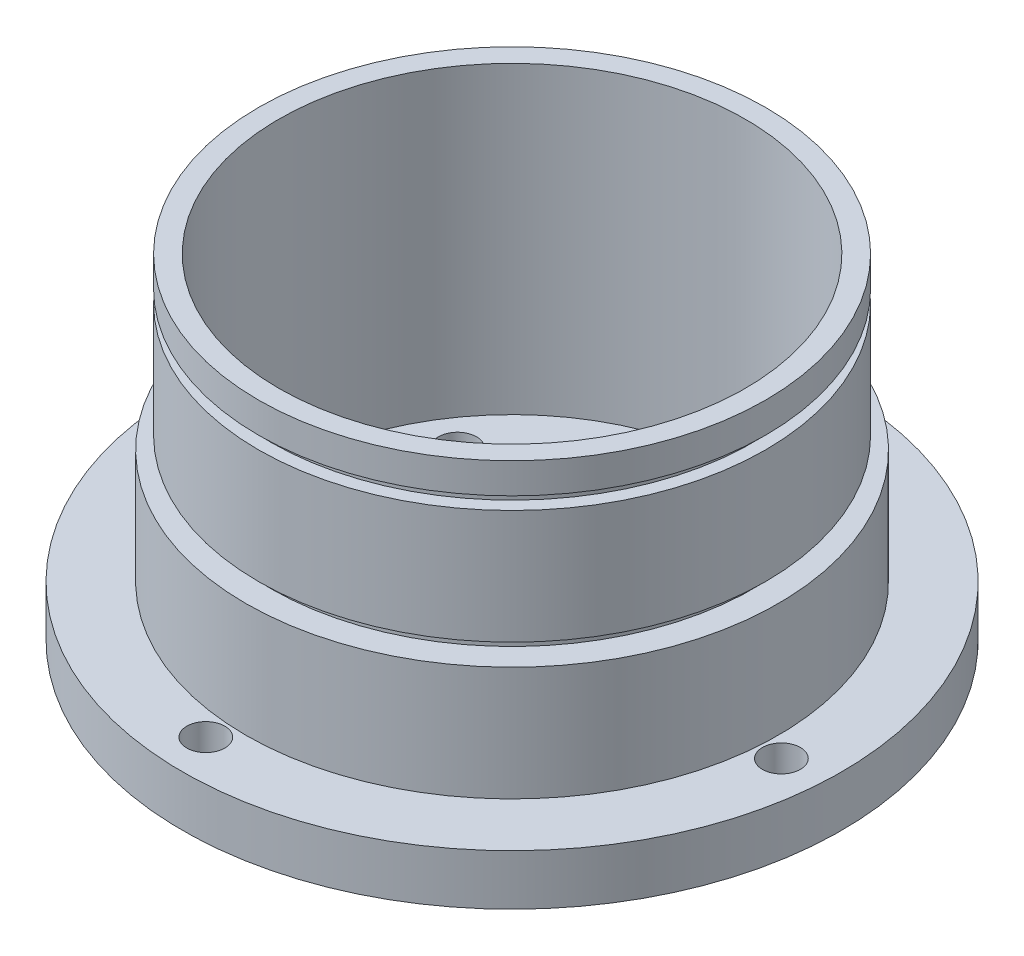
ISO-10303-21;
HEADER;
FILE_DESCRIPTION(('STEP AP214'),'2;1');
FILE_NAME('part.step','',(''),(''),'','','');
FILE_SCHEMA(('AUTOMOTIVE_DESIGN { 1 0 10303 214 1 1 1 1 }'));
ENDSEC;
DATA;
#1=APPLICATION_CONTEXT('core data for automotive mechanical design processes');
#2=APPLICATION_PROTOCOL_DEFINITION('international standard','automotive_design',2000,#1);
#3=PRODUCT_CONTEXT('',#1,'mechanical');
#4=PRODUCT('Part','Part','',(#3));
#5=PRODUCT_RELATED_PRODUCT_CATEGORY('part','',(#4));
#6=PRODUCT_DEFINITION_FORMATION('','',#4);
#7=PRODUCT_DEFINITION_CONTEXT('part definition',#1,'design');
#8=PRODUCT_DEFINITION('design','',#6,#7);
#9=PRODUCT_DEFINITION_SHAPE('','',#8);
#10=(LENGTH_UNIT() NAMED_UNIT(*) SI_UNIT(.MILLI.,.METRE.));
#11=(NAMED_UNIT(*) PLANE_ANGLE_UNIT() SI_UNIT($,.RADIAN.));
#12=(NAMED_UNIT(*) SI_UNIT($,.STERADIAN.) SOLID_ANGLE_UNIT());
#13=UNCERTAINTY_MEASURE_WITH_UNIT(LENGTH_MEASURE(1.E-05),#10,'distance_accuracy_value','');
#14=(GEOMETRIC_REPRESENTATION_CONTEXT(3) GLOBAL_UNCERTAINTY_ASSIGNED_CONTEXT((#13)) GLOBAL_UNIT_ASSIGNED_CONTEXT((#10,
#11,#12)) REPRESENTATION_CONTEXT('',''));
#15=CARTESIAN_POINT('',(0.,0.,0.));
#16=DIRECTION('',(0.,0.,1.));
#17=DIRECTION('',(1.,0.,0.));
#18=AXIS2_PLACEMENT_3D('',#15,#16,#17);
#19=CARTESIAN_POINT('',(0.,34.,0.));
#20=DIRECTION('',(0.,-1.,0.));
#21=DIRECTION('',(0.,0.,-1.));
#22=AXIS2_PLACEMENT_3D('',#19,#20,#21);
#23=CYLINDRICAL_SURFACE('',#22,20.);
#24=CARTESIAN_POINT('',(0.,26.4,0.));
#25=DIRECTION('',(0.,1.,0.));
#26=DIRECTION('',(0.,0.,1.));
#27=AXIS2_PLACEMENT_3D('',#24,#25,#26);
#28=CIRCLE('',#27,20.);
#29=CARTESIAN_POINT('',(0.,26.4,20.));
#30=VERTEX_POINT('',#29);
#31=EDGE_CURVE('E120',#30,#30,#28,.T.);
#32=ORIENTED_EDGE('',*,*,#31,.F.);
#33=EDGE_LOOP('',(#32));
#34=FACE_BOUND('',#33,.T.);
#35=CARTESIAN_POINT('',(0.,24.,0.));
#36=DIRECTION('',(0.,-1.,0.));
#37=DIRECTION('',(0.,0.,-1.));
#38=AXIS2_PLACEMENT_3D('',#35,#36,#37);
#39=CIRCLE('',#38,20.);
#40=CARTESIAN_POINT('',(0.,24.,-20.));
#41=VERTEX_POINT('',#40);
#42=EDGE_CURVE('E112',#41,#41,#39,.T.);
#43=ORIENTED_EDGE('',*,*,#42,.F.);
#44=EDGE_LOOP('',(#43));
#45=FACE_BOUND('',#44,.T.);
#46=ADVANCED_FACE('F37',(#34,#45),#23,.T.);
#47=CARTESIAN_POINT('',(0.,26.4,0.));
#48=DIRECTION('',(0.,1.,0.));
#49=DIRECTION('',(0.,0.,1.));
#50=AXIS2_PLACEMENT_3D('',#47,#48,#49);
#51=PLANE('',#50);
#52=CARTESIAN_POINT('',(0.,26.4,0.));
#53=DIRECTION('',(0.,1.,0.));
#54=DIRECTION('',(0.,0.,1.));
#55=AXIS2_PLACEMENT_3D('',#52,#53,#54);
#56=CIRCLE('',#55,18.4);
#57=CARTESIAN_POINT('',(0.,26.4,18.4));
#58=VERTEX_POINT('',#57);
#59=EDGE_CURVE('E179',#58,#58,#56,.T.);
#60=ORIENTED_EDGE('',*,*,#59,.F.);
#61=EDGE_LOOP('',(#60));
#62=FACE_BOUND('',#61,.T.);
#63=ORIENTED_EDGE('',*,*,#31,.T.);
#64=EDGE_LOOP('',(#63));
#65=FACE_BOUND('',#64,.T.);
#66=ADVANCED_FACE('F231',(#62,#65),#51,.T.);
#67=CARTESIAN_POINT('',(0.,14.,0.));
#68=DIRECTION('',(0.,-1.,0.));
#69=DIRECTION('',(0.,0.,-1.));
#70=AXIS2_PLACEMENT_3D('',#67,#68,#69);
#71=PLANE('',#70);
#72=CARTESIAN_POINT('',(0.,14.,0.));
#73=DIRECTION('',(0.,-1.,0.));
#74=DIRECTION('',(0.,0.,-1.));
#75=AXIS2_PLACEMENT_3D('',#72,#73,#74);
#76=CIRCLE('',#75,19.);
#77=CARTESIAN_POINT('',(0.,14.,-19.));
#78=VERTEX_POINT('',#77);
#79=EDGE_CURVE('E124',#78,#78,#76,.T.);
#80=ORIENTED_EDGE('',*,*,#79,.F.);
#81=EDGE_LOOP('',(#80));
#82=FACE_BOUND('',#81,.T.);
#83=CARTESIAN_POINT('',(0.,14.,0.));
#84=DIRECTION('',(0.,-1.,0.));
#85=DIRECTION('',(0.,0.,-1.));
#86=AXIS2_PLACEMENT_3D('',#83,#84,#85);
#87=CIRCLE('',#86,20.);
#88=CARTESIAN_POINT('',(0.,14.,-20.));
#89=VERTEX_POINT('',#88);
#90=EDGE_CURVE('E115',#89,#89,#87,.T.);
#91=ORIENTED_EDGE('',*,*,#90,.T.);
#92=EDGE_LOOP('',(#91));
#93=FACE_BOUND('',#92,.T.);
#94=ADVANCED_FACE('F238',(#82,#93),#71,.T.);
#95=CARTESIAN_POINT('',(0.,26.4,0.));
#96=DIRECTION('',(0.,-1.,0.));
#97=DIRECTION('',(0.,0.,-1.));
#98=AXIS2_PLACEMENT_3D('',#95,#96,#97);
#99=CYLINDRICAL_SURFACE('',#98,21.);
#100=CARTESIAN_POINT('',(0.,13.,0.));
#101=DIRECTION('',(0.,-1.,0.));
#102=DIRECTION('',(0.,0.,-1.));
#103=AXIS2_PLACEMENT_3D('',#100,#101,#102);
#104=CIRCLE('',#103,21.);
#105=CARTESIAN_POINT('',(0.,13.,-21.));
#106=VERTEX_POINT('',#105);
#107=EDGE_CURVE('E127',#106,#106,#104,.T.);
#108=ORIENTED_EDGE('',*,*,#107,.T.);
#109=EDGE_LOOP('',(#108));
#110=FACE_BOUND('',#109,.T.);
#111=CARTESIAN_POINT('',(0.,4.,0.));
#112=DIRECTION('',(0.,-1.,0.));
#113=DIRECTION('',(0.,0.,-1.));
#114=AXIS2_PLACEMENT_3D('',#111,#112,#113);
#115=CIRCLE('',#114,21.);
#116=CARTESIAN_POINT('',(0.,4.,-21.));
#117=VERTEX_POINT('',#116);
#118=EDGE_CURVE('E178',#117,#117,#115,.T.);
#119=ORIENTED_EDGE('',*,*,#118,.F.);
#120=EDGE_LOOP('',(#119));
#121=FACE_BOUND('',#120,.T.);
#122=ADVANCED_FACE('F39',(#110,#121),#99,.T.);
#123=CARTESIAN_POINT('',(0.,0.,0.));
#124=DIRECTION('',(0.,1.,0.));
#125=DIRECTION('',(0.,0.,1.));
#126=AXIS2_PLACEMENT_3D('',#123,#124,#125);
#127=PLANE('',#126);
#128=DIRECTION('',(-1.,0.,0.));
#129=VECTOR('',#128,1.);
#130=CARTESIAN_POINT('',(7.,0.,6.01880927317566));
#131=LINE('',#130,#129);
#132=CARTESIAN_POINT('',(7.,0.,6.01880927317566));
#133=VERTEX_POINT('',#132);
#134=CARTESIAN_POINT('',(-6.40139772325909,0.,6.01880927317566));
#135=VERTEX_POINT('',#134);
#136=EDGE_CURVE('E89',#133,#135,#131,.T.);
#137=ORIENTED_EDGE('',*,*,#136,.F.);
#138=CARTESIAN_POINT('',(7.,0.,0.));
#139=DIRECTION('',(0.,-1.,0.));
#140=DIRECTION('',(0.,0.,-1.));
#141=AXIS2_PLACEMENT_3D('',#138,#139,#140);
#142=CIRCLE('',#141,6.01880927317566);
#143=CARTESIAN_POINT('',(7.,0.,-6.01880927317566));
#144=VERTEX_POINT('',#143);
#145=EDGE_CURVE('E52',#144,#133,#142,.T.);
#146=ORIENTED_EDGE('',*,*,#145,.F.);
#147=DIRECTION('',(1.,0.,0.));
#148=VECTOR('',#147,1.);
#149=CARTESIAN_POINT('',(7.,0.,-6.01880927317566));
#150=LINE('',#149,#148);
#151=CARTESIAN_POINT('',(-6.40139772325909,0.,-6.01880927317566));
#152=VERTEX_POINT('',#151);
#153=EDGE_CURVE('E96',#152,#144,#150,.T.);
#154=ORIENTED_EDGE('',*,*,#153,.F.);
#155=CARTESIAN_POINT('',(-6.40139772325909,0.,0.));
#156=DIRECTION('',(0.,-1.,0.));
#157=DIRECTION('',(0.,0.,-1.));
#158=AXIS2_PLACEMENT_3D('',#155,#156,#157);
#159=CIRCLE('',#158,6.01880927317566);
#160=EDGE_CURVE('E80',#135,#152,#159,.T.);
#161=ORIENTED_EDGE('',*,*,#160,.F.);
#162=EDGE_LOOP('',(#137,#146,#154,#161));
#163=FACE_BOUND('',#162,.T.);
#164=CARTESIAN_POINT('',(1.45749351454885,0.,-22.7032643612113));
#165=DIRECTION('',(0.,1.,0.));
#166=DIRECTION('',(0.,0.,1.));
#167=AXIS2_PLACEMENT_3D('',#164,#165,#166);
#168=CIRCLE('',#167,1.5);
#169=CARTESIAN_POINT('',(1.45749351454885,0.,-21.2032643612113));
#170=VERTEX_POINT('',#169);
#171=EDGE_CURVE('E133',#170,#170,#168,.T.);
#172=ORIENTED_EDGE('',*,*,#171,.T.);
#173=EDGE_LOOP('',(#172));
#174=FACE_BOUND('',#173,.T.);
#175=CARTESIAN_POINT('',(22.7032643612113,0.,1.45749351454892));
#176=DIRECTION('',(0.,1.,0.));
#177=DIRECTION('',(0.,0.,1.));
#178=AXIS2_PLACEMENT_3D('',#175,#176,#177);
#179=CIRCLE('',#178,1.5);
#180=CARTESIAN_POINT('',(22.7032643612113,0.,2.95749351454892));
#181=VERTEX_POINT('',#180);
#182=EDGE_CURVE('E140',#181,#181,#179,.T.);
#183=ORIENTED_EDGE('',*,*,#182,.T.);
#184=EDGE_LOOP('',(#183));
#185=FACE_BOUND('',#184,.T.);
#186=CARTESIAN_POINT('',(-1.45749351454821,0.,22.7032643612114));
#187=DIRECTION('',(0.,1.,0.));
#188=DIRECTION('',(0.,0.,1.));
#189=AXIS2_PLACEMENT_3D('',#186,#187,#188);
#190=CIRCLE('',#189,1.50000000000075);
#191=CARTESIAN_POINT('',(-1.45749351454821,0.,24.2032643612121));
#192=VERTEX_POINT('',#191);
#193=EDGE_CURVE('E146',#192,#192,#190,.T.);
#194=ORIENTED_EDGE('',*,*,#193,.T.);
#195=EDGE_LOOP('',(#194));
#196=FACE_BOUND('',#195,.T.);
#197=CARTESIAN_POINT('',(-22.703264361211,0.,-1.4574935145485));
#198=DIRECTION('',(0.,1.,0.));
#199=DIRECTION('',(0.,0.,1.));
#200=AXIS2_PLACEMENT_3D('',#197,#198,#199);
#201=CIRCLE('',#200,1.50000000000064);
#202=CARTESIAN_POINT('',(-22.703264361211,0.,0.0425064854521436));
#203=VERTEX_POINT('',#202);
#204=EDGE_CURVE('E152',#203,#203,#201,.T.);
#205=ORIENTED_EDGE('',*,*,#204,.T.);
#206=EDGE_LOOP('',(#205));
#207=FACE_BOUND('',#206,.T.);
#208=CARTESIAN_POINT('',(-0.993017559361624,0.,15.46815813621));
#209=DIRECTION('',(0.,-1.,0.));
#210=DIRECTION('',(0.,0.,-1.));
#211=AXIS2_PLACEMENT_3D('',#208,#209,#210);
#212=CIRCLE('',#211,1.5);
#213=CARTESIAN_POINT('',(-0.993017559361624,0.,13.96815813621));
#214=VERTEX_POINT('',#213);
#215=EDGE_CURVE('E157',#214,#214,#212,.T.);
#216=ORIENTED_EDGE('',*,*,#215,.F.);
#217=EDGE_LOOP('',(#216));
#218=FACE_BOUND('',#217,.T.);
#219=CARTESIAN_POINT('',(-13.8923266753933,0.,6.87410063529324));
#220=DIRECTION('',(0.,-1.,0.));
#221=DIRECTION('',(0.,0.,-1.));
#222=AXIS2_PLACEMENT_3D('',#219,#220,#221);
#223=CIRCLE('',#222,1.50000000000065);
#224=CARTESIAN_POINT('',(-13.8923266753933,0.,5.37410063529259));
#225=VERTEX_POINT('',#224);
#226=EDGE_CURVE('E136',#225,#225,#223,.T.);
#227=ORIENTED_EDGE('',*,*,#226,.F.);
#228=EDGE_LOOP('',(#227));
#229=FACE_BOUND('',#228,.T.);
#230=CARTESIAN_POINT('',(-12.899309116031,0.,-8.59405750091672));
#231=DIRECTION('',(0.,-1.,0.));
#232=DIRECTION('',(0.,0.,-1.));
#233=AXIS2_PLACEMENT_3D('',#230,#231,#232);
#234=CIRCLE('',#233,1.50000000000125);
#235=CARTESIAN_POINT('',(-12.899309116031,0.,-10.094057500918));
#236=VERTEX_POINT('',#235);
#237=EDGE_CURVE('E164',#236,#236,#234,.T.);
#238=ORIENTED_EDGE('',*,*,#237,.F.);
#239=EDGE_LOOP('',(#238));
#240=FACE_BOUND('',#239,.T.);
#241=CARTESIAN_POINT('',(0.99301755936295,0.,-15.4681581362099));
#242=DIRECTION('',(0.,-1.,0.));
#243=DIRECTION('',(0.,0.,-1.));
#244=AXIS2_PLACEMENT_3D('',#241,#242,#243);
#245=CIRCLE('',#244,1.50000000000139);
#246=CARTESIAN_POINT('',(0.99301755936295,0.,-16.9681581362113));
#247=VERTEX_POINT('',#246);
#248=EDGE_CURVE('E170',#247,#247,#245,.T.);
#249=ORIENTED_EDGE('',*,*,#248,.F.);
#250=EDGE_LOOP('',(#249));
#251=FACE_BOUND('',#250,.T.);
#252=CARTESIAN_POINT('',(13.8923266753946,0.,-6.87410063529318));
#253=DIRECTION('',(0.,-1.,0.));
#254=DIRECTION('',(0.,0.,-1.));
#255=AXIS2_PLACEMENT_3D('',#252,#253,#254);
#256=CIRCLE('',#255,1.5000000000009);
#257=CARTESIAN_POINT('',(13.8923266753946,0.,-8.37410063529408));
#258=VERTEX_POINT('',#257);
#259=EDGE_CURVE('E167',#258,#258,#256,.T.);
#260=ORIENTED_EDGE('',*,*,#259,.F.);
#261=EDGE_LOOP('',(#260));
#262=FACE_BOUND('',#261,.T.);
#263=CARTESIAN_POINT('',(12.8993091160323,0.,8.59405750091678));
#264=DIRECTION('',(0.,-1.,0.));
#265=DIRECTION('',(0.,0.,-1.));
#266=AXIS2_PLACEMENT_3D('',#263,#264,#265);
#267=CIRCLE('',#266,1.50000000000022);
#268=CARTESIAN_POINT('',(12.8993091160323,0.,7.09405750091656));
#269=VERTEX_POINT('',#268);
#270=EDGE_CURVE('E161',#269,#269,#267,.T.);
#271=ORIENTED_EDGE('',*,*,#270,.F.);
#272=EDGE_LOOP('',(#271));
#273=FACE_BOUND('',#272,.T.);
#274=CARTESIAN_POINT('',(0.,0.,0.));
#275=DIRECTION('',(0.,-1.,0.));
#276=DIRECTION('',(0.,0.,-1.));
#277=AXIS2_PLACEMENT_3D('',#274,#275,#276);
#278=CIRCLE('',#277,26.);
#279=CARTESIAN_POINT('',(0.,0.,-26.));
#280=VERTEX_POINT('',#279);
#281=EDGE_CURVE('E214',#280,#280,#278,.T.);
#282=ORIENTED_EDGE('',*,*,#281,.T.);
#283=EDGE_LOOP('',(#282));
#284=FACE_BOUND('',#283,.T.);
#285=ADVANCED_FACE('F93',(#163,#174,#185,#196,#207,#218,#229,#240,#251,#262,#273,#284),#127,.F.);
#286=CARTESIAN_POINT('',(0.,2.4,0.));
#287=DIRECTION('',(0.,1.,0.));
#288=DIRECTION('',(0.,0.,1.));
#289=AXIS2_PLACEMENT_3D('',#286,#287,#288);
#290=CYLINDRICAL_SURFACE('',#289,18.4);
#291=CARTESIAN_POINT('',(0.,2.4,0.));
#292=DIRECTION('',(0.,1.,0.));
#293=DIRECTION('',(0.,0.,1.));
#294=AXIS2_PLACEMENT_3D('',#291,#292,#293);
#295=CIRCLE('',#294,18.4);
#296=CARTESIAN_POINT('',(0.,2.4,18.4));
#297=VERTEX_POINT('',#296);
#298=EDGE_CURVE('E175',#297,#297,#295,.T.);
#299=ORIENTED_EDGE('',*,*,#298,.F.);
#300=EDGE_LOOP('',(#299));
#301=FACE_BOUND('',#300,.T.);
#302=ORIENTED_EDGE('',*,*,#59,.T.);
#303=EDGE_LOOP('',(#302));
#304=FACE_BOUND('',#303,.T.);
#305=ADVANCED_FACE('F320',(#301,#304),#290,.F.);
#306=CARTESIAN_POINT('',(0.,2.4,0.));
#307=DIRECTION('',(0.,1.,0.));
#308=DIRECTION('',(0.,0.,1.));
#309=AXIS2_PLACEMENT_3D('',#306,#307,#308);
#310=PLANE('',#309);
#311=CARTESIAN_POINT('',(7.,2.4,0.));
#312=DIRECTION('',(0.,1.,0.));
#313=DIRECTION('',(0.,0.,1.));
#314=AXIS2_PLACEMENT_3D('',#311,#312,#313);
#315=CIRCLE('',#314,6.01880927317566);
#316=CARTESIAN_POINT('',(7.,2.4,6.01880927317566));
#317=VERTEX_POINT('',#316);
#318=CARTESIAN_POINT('',(7.,2.4,-6.01880927317566));
#319=VERTEX_POINT('',#318);
#320=EDGE_CURVE('E11',#317,#319,#315,.T.);
#321=ORIENTED_EDGE('',*,*,#320,.F.);
#322=DIRECTION('',(1.,0.,0.));
#323=VECTOR('',#322,1.);
#324=CARTESIAN_POINT('',(0.,2.4,6.01880927317566));
#325=LINE('',#324,#323);
#326=CARTESIAN_POINT('',(-6.40139772325909,2.4,6.01880927317566));
#327=VERTEX_POINT('',#326);
#328=EDGE_CURVE('E201',#327,#317,#325,.T.);
#329=ORIENTED_EDGE('',*,*,#328,.F.);
#330=CARTESIAN_POINT('',(-6.40139772325909,2.4,0.));
#331=DIRECTION('',(0.,1.,0.));
#332=DIRECTION('',(0.,0.,1.));
#333=AXIS2_PLACEMENT_3D('',#330,#331,#332);
#334=CIRCLE('',#333,6.01880927317566);
#335=CARTESIAN_POINT('',(-6.40139772325909,2.4,-6.01880927317566));
#336=VERTEX_POINT('',#335);
#337=EDGE_CURVE('E83',#336,#327,#334,.T.);
#338=ORIENTED_EDGE('',*,*,#337,.F.);
#339=DIRECTION('',(-1.,0.,0.));
#340=VECTOR('',#339,1.);
#341=CARTESIAN_POINT('',(0.,2.4,-6.01880927317566));
#342=LINE('',#341,#340);
#343=EDGE_CURVE('E45',#319,#336,#342,.T.);
#344=ORIENTED_EDGE('',*,*,#343,.F.);
#345=EDGE_LOOP('',(#321,#329,#338,#344));
#346=FACE_BOUND('',#345,.T.);
#347=CARTESIAN_POINT('',(-0.993017559361624,2.4,15.46815813621));
#348=DIRECTION('',(0.,1.,0.));
#349=DIRECTION('',(0.,0.,1.));
#350=AXIS2_PLACEMENT_3D('',#347,#348,#349);
#351=CIRCLE('',#350,1.5);
#352=CARTESIAN_POINT('',(-0.993017559361624,2.4,16.96815813621));
#353=VERTEX_POINT('',#352);
#354=EDGE_CURVE('E182',#353,#353,#351,.T.);
#355=ORIENTED_EDGE('',*,*,#354,.F.);
#356=EDGE_LOOP('',(#355));
#357=FACE_BOUND('',#356,.T.);
#358=CARTESIAN_POINT('',(-13.8923266753933,2.4,6.87410063529324));
#359=DIRECTION('',(0.,1.,0.));
#360=DIRECTION('',(0.,0.,1.));
#361=AXIS2_PLACEMENT_3D('',#358,#359,#360);
#362=CIRCLE('',#361,1.50000000000065);
#363=CARTESIAN_POINT('',(-13.8923266753933,2.4,8.37410063529389));
#364=VERTEX_POINT('',#363);
#365=EDGE_CURVE('E194',#364,#364,#362,.T.);
#366=ORIENTED_EDGE('',*,*,#365,.F.);
#367=EDGE_LOOP('',(#366));
#368=FACE_BOUND('',#367,.T.);
#369=CARTESIAN_POINT('',(-12.899309116031,2.4,-8.59405750091672));
#370=DIRECTION('',(0.,1.,0.));
#371=DIRECTION('',(0.,0.,1.));
#372=AXIS2_PLACEMENT_3D('',#369,#370,#371);
#373=CIRCLE('',#372,1.50000000000125);
#374=CARTESIAN_POINT('',(-12.899309116031,2.4,-7.09405750091547));
#375=VERTEX_POINT('',#374);
#376=EDGE_CURVE('E191',#375,#375,#373,.T.);
#377=ORIENTED_EDGE('',*,*,#376,.F.);
#378=EDGE_LOOP('',(#377));
#379=FACE_BOUND('',#378,.T.);
#380=CARTESIAN_POINT('',(0.99301755936295,2.4,-15.4681581362099));
#381=DIRECTION('',(0.,1.,0.));
#382=DIRECTION('',(0.,0.,1.));
#383=AXIS2_PLACEMENT_3D('',#380,#381,#382);
#384=CIRCLE('',#383,1.50000000000139);
#385=CARTESIAN_POINT('',(0.99301755936295,2.4,-13.9681581362085));
#386=VERTEX_POINT('',#385);
#387=EDGE_CURVE('E188',#386,#386,#384,.T.);
#388=ORIENTED_EDGE('',*,*,#387,.F.);
#389=EDGE_LOOP('',(#388));
#390=FACE_BOUND('',#389,.T.);
#391=CARTESIAN_POINT('',(13.8923266753946,2.4,-6.87410063529318));
#392=DIRECTION('',(0.,1.,0.));
#393=DIRECTION('',(0.,0.,1.));
#394=AXIS2_PLACEMENT_3D('',#391,#392,#393);
#395=CIRCLE('',#394,1.5000000000009);
#396=CARTESIAN_POINT('',(13.8923266753946,2.4,-5.37410063529228));
#397=VERTEX_POINT('',#396);
#398=EDGE_CURVE('E185',#397,#397,#395,.T.);
#399=ORIENTED_EDGE('',*,*,#398,.F.);
#400=EDGE_LOOP('',(#399));
#401=FACE_BOUND('',#400,.T.);
#402=CARTESIAN_POINT('',(12.8993091160323,2.4,8.59405750091678));
#403=DIRECTION('',(0.,1.,0.));
#404=DIRECTION('',(0.,0.,1.));
#405=AXIS2_PLACEMENT_3D('',#402,#403,#404);
#406=CIRCLE('',#405,1.50000000000022);
#407=CARTESIAN_POINT('',(12.8993091160323,2.4,10.094057500917));
#408=VERTEX_POINT('',#407);
#409=EDGE_CURVE('E160',#408,#408,#406,.T.);
#410=ORIENTED_EDGE('',*,*,#409,.F.);
#411=EDGE_LOOP('',(#410));
#412=FACE_BOUND('',#411,.T.);
#413=ORIENTED_EDGE('',*,*,#298,.T.);
#414=EDGE_LOOP('',(#413));
#415=FACE_BOUND('',#414,.T.);
#416=ADVANCED_FACE('F209',(#346,#357,#368,#379,#390,#401,#412,#415),#310,.T.);
#417=CARTESIAN_POINT('',(12.8993091160323,24.,8.59405750091678));
#418=DIRECTION('',(0.,-1.,0.));
#419=DIRECTION('',(0.,0.,-1.));
#420=AXIS2_PLACEMENT_3D('',#417,#418,#419);
#421=CYLINDRICAL_SURFACE('',#420,1.50000000000022);
#422=ORIENTED_EDGE('',*,*,#409,.T.);
#423=EDGE_LOOP('',(#422));
#424=FACE_BOUND('',#423,.T.);
#425=ORIENTED_EDGE('',*,*,#270,.T.);
#426=EDGE_LOOP('',(#425));
#427=FACE_BOUND('',#426,.T.);
#428=ADVANCED_FACE('F303',(#424,#427),#421,.F.);
#429=CARTESIAN_POINT('',(13.8923266753946,24.,-6.87410063529318));
#430=DIRECTION('',(0.,-1.,0.));
#431=DIRECTION('',(0.,0.,-1.));
#432=AXIS2_PLACEMENT_3D('',#429,#430,#431);
#433=CYLINDRICAL_SURFACE('',#432,1.5000000000009);
#434=ORIENTED_EDGE('',*,*,#398,.T.);
#435=EDGE_LOOP('',(#434));
#436=FACE_BOUND('',#435,.T.);
#437=ORIENTED_EDGE('',*,*,#259,.T.);
#438=EDGE_LOOP('',(#437));
#439=FACE_BOUND('',#438,.T.);
#440=ADVANCED_FACE('F306',(#436,#439),#433,.F.);
#441=CARTESIAN_POINT('',(0.99301755936295,24.,-15.4681581362099));
#442=DIRECTION('',(0.,-1.,0.));
#443=DIRECTION('',(0.,0.,-1.));
#444=AXIS2_PLACEMENT_3D('',#441,#442,#443);
#445=CYLINDRICAL_SURFACE('',#444,1.50000000000139);
#446=ORIENTED_EDGE('',*,*,#387,.T.);
#447=EDGE_LOOP('',(#446));
#448=FACE_BOUND('',#447,.T.);
#449=ORIENTED_EDGE('',*,*,#248,.T.);
#450=EDGE_LOOP('',(#449));
#451=FACE_BOUND('',#450,.T.);
#452=ADVANCED_FACE('F310',(#448,#451),#445,.F.);
#453=CARTESIAN_POINT('',(-12.899309116031,24.,-8.59405750091672));
#454=DIRECTION('',(0.,-1.,0.));
#455=DIRECTION('',(0.,0.,-1.));
#456=AXIS2_PLACEMENT_3D('',#453,#454,#455);
#457=CYLINDRICAL_SURFACE('',#456,1.50000000000125);
#458=ORIENTED_EDGE('',*,*,#376,.T.);
#459=EDGE_LOOP('',(#458));
#460=FACE_BOUND('',#459,.T.);
#461=ORIENTED_EDGE('',*,*,#237,.T.);
#462=EDGE_LOOP('',(#461));
#463=FACE_BOUND('',#462,.T.);
#464=ADVANCED_FACE('F301',(#460,#463),#457,.F.);
#465=CARTESIAN_POINT('',(-13.8923266753933,24.,6.87410063529324));
#466=DIRECTION('',(0.,-1.,0.));
#467=DIRECTION('',(0.,0.,-1.));
#468=AXIS2_PLACEMENT_3D('',#465,#466,#467);
#469=CYLINDRICAL_SURFACE('',#468,1.50000000000065);
#470=ORIENTED_EDGE('',*,*,#365,.T.);
#471=EDGE_LOOP('',(#470));
#472=FACE_BOUND('',#471,.T.);
#473=ORIENTED_EDGE('',*,*,#226,.T.);
#474=EDGE_LOOP('',(#473));
#475=FACE_BOUND('',#474,.T.);
#476=ADVANCED_FACE('F297',(#472,#475),#469,.F.);
#477=CARTESIAN_POINT('',(-0.993017559361624,24.,15.46815813621));
#478=DIRECTION('',(0.,-1.,0.));
#479=DIRECTION('',(0.,0.,-1.));
#480=AXIS2_PLACEMENT_3D('',#477,#478,#479);
#481=CYLINDRICAL_SURFACE('',#480,1.5);
#482=ORIENTED_EDGE('',*,*,#354,.T.);
#483=EDGE_LOOP('',(#482));
#484=FACE_BOUND('',#483,.T.);
#485=ORIENTED_EDGE('',*,*,#215,.T.);
#486=EDGE_LOOP('',(#485));
#487=FACE_BOUND('',#486,.T.);
#488=ADVANCED_FACE('F293',(#484,#487),#481,.F.);
#489=CARTESIAN_POINT('',(0.,4.,0.));
#490=DIRECTION('',(0.,-1.,0.));
#491=DIRECTION('',(0.,0.,-1.));
#492=AXIS2_PLACEMENT_3D('',#489,#490,#491);
#493=PLANE('',#492);
#494=CARTESIAN_POINT('',(1.45749351454885,4.,-22.7032643612113));
#495=DIRECTION('',(0.,1.,0.));
#496=DIRECTION('',(0.,0.,1.));
#497=AXIS2_PLACEMENT_3D('',#494,#495,#496);
#498=CIRCLE('',#497,1.5);
#499=CARTESIAN_POINT('',(1.45749351454885,4.,-21.2032643612113));
#500=VERTEX_POINT('',#499);
#501=EDGE_CURVE('E137',#500,#500,#498,.T.);
#502=ORIENTED_EDGE('',*,*,#501,.F.);
#503=EDGE_LOOP('',(#502));
#504=FACE_BOUND('',#503,.T.);
#505=CARTESIAN_POINT('',(22.7032643612113,4.,1.45749351454892));
#506=DIRECTION('',(0.,1.,0.));
#507=DIRECTION('',(0.,0.,1.));
#508=AXIS2_PLACEMENT_3D('',#505,#506,#507);
#509=CIRCLE('',#508,1.5);
#510=CARTESIAN_POINT('',(22.7032643612113,4.,2.95749351454892));
#511=VERTEX_POINT('',#510);
#512=EDGE_CURVE('E143',#511,#511,#509,.T.);
#513=ORIENTED_EDGE('',*,*,#512,.F.);
#514=EDGE_LOOP('',(#513));
#515=FACE_BOUND('',#514,.T.);
#516=CARTESIAN_POINT('',(-1.45749351454821,4.,22.7032643612114));
#517=DIRECTION('',(0.,1.,0.));
#518=DIRECTION('',(0.,0.,1.));
#519=AXIS2_PLACEMENT_3D('',#516,#517,#518);
#520=CIRCLE('',#519,1.50000000000075);
#521=CARTESIAN_POINT('',(-1.45749351454821,4.,24.2032643612121));
#522=VERTEX_POINT('',#521);
#523=EDGE_CURVE('E149',#522,#522,#520,.T.);
#524=ORIENTED_EDGE('',*,*,#523,.F.);
#525=EDGE_LOOP('',(#524));
#526=FACE_BOUND('',#525,.T.);
#527=CARTESIAN_POINT('',(-22.703264361211,4.,-1.4574935145485));
#528=DIRECTION('',(0.,1.,0.));
#529=DIRECTION('',(0.,0.,1.));
#530=AXIS2_PLACEMENT_3D('',#527,#528,#529);
#531=CIRCLE('',#530,1.50000000000064);
#532=CARTESIAN_POINT('',(-22.703264361211,4.,0.0425064854521436));
#533=VERTEX_POINT('',#532);
#534=EDGE_CURVE('E132',#533,#533,#531,.T.);
#535=ORIENTED_EDGE('',*,*,#534,.F.);
#536=EDGE_LOOP('',(#535));
#537=FACE_BOUND('',#536,.T.);
#538=ORIENTED_EDGE('',*,*,#118,.T.);
#539=EDGE_LOOP('',(#538));
#540=FACE_BOUND('',#539,.T.);
#541=CARTESIAN_POINT('',(0.,4.,0.));
#542=DIRECTION('',(0.,-1.,0.));
#543=DIRECTION('',(0.,0.,-1.));
#544=AXIS2_PLACEMENT_3D('',#541,#542,#543);
#545=CIRCLE('',#544,26.);
#546=CARTESIAN_POINT('',(0.,4.,-26.));
#547=VERTEX_POINT('',#546);
#548=EDGE_CURVE('E212',#547,#547,#545,.T.);
#549=ORIENTED_EDGE('',*,*,#548,.F.);
#550=EDGE_LOOP('',(#549));
#551=FACE_BOUND('',#550,.T.);
#552=ADVANCED_FACE('F289',(#504,#515,#526,#537,#540,#551),#493,.F.);
#553=CARTESIAN_POINT('',(-22.703264361211,0.,-1.4574935145485));
#554=DIRECTION('',(0.,1.,0.));
#555=DIRECTION('',(0.,0.,1.));
#556=AXIS2_PLACEMENT_3D('',#553,#554,#555);
#557=CYLINDRICAL_SURFACE('',#556,1.50000000000064);
#558=ORIENTED_EDGE('',*,*,#204,.F.);
#559=EDGE_LOOP('',(#558));
#560=FACE_BOUND('',#559,.T.);
#561=ORIENTED_EDGE('',*,*,#534,.T.);
#562=EDGE_LOOP('',(#561));
#563=FACE_BOUND('',#562,.T.);
#564=ADVANCED_FACE('F285',(#560,#563),#557,.F.);
#565=CARTESIAN_POINT('',(-1.45749351454821,0.,22.7032643612114));
#566=DIRECTION('',(0.,1.,0.));
#567=DIRECTION('',(0.,0.,1.));
#568=AXIS2_PLACEMENT_3D('',#565,#566,#567);
#569=CYLINDRICAL_SURFACE('',#568,1.50000000000075);
#570=ORIENTED_EDGE('',*,*,#193,.F.);
#571=EDGE_LOOP('',(#570));
#572=FACE_BOUND('',#571,.T.);
#573=ORIENTED_EDGE('',*,*,#523,.T.);
#574=EDGE_LOOP('',(#573));
#575=FACE_BOUND('',#574,.T.);
#576=ADVANCED_FACE('F281',(#572,#575),#569,.F.);
#577=CARTESIAN_POINT('',(22.7032643612113,0.,1.45749351454892));
#578=DIRECTION('',(0.,1.,0.));
#579=DIRECTION('',(0.,0.,1.));
#580=AXIS2_PLACEMENT_3D('',#577,#578,#579);
#581=CYLINDRICAL_SURFACE('',#580,1.5);
#582=ORIENTED_EDGE('',*,*,#182,.F.);
#583=EDGE_LOOP('',(#582));
#584=FACE_BOUND('',#583,.T.);
#585=ORIENTED_EDGE('',*,*,#512,.T.);
#586=EDGE_LOOP('',(#585));
#587=FACE_BOUND('',#586,.T.);
#588=ADVANCED_FACE('F277',(#584,#587),#581,.F.);
#589=CARTESIAN_POINT('',(1.45749351454885,0.,-22.7032643612113));
#590=DIRECTION('',(0.,1.,0.));
#591=DIRECTION('',(0.,0.,1.));
#592=AXIS2_PLACEMENT_3D('',#589,#590,#591);
#593=CYLINDRICAL_SURFACE('',#592,1.5);
#594=ORIENTED_EDGE('',*,*,#171,.F.);
#595=EDGE_LOOP('',(#594));
#596=FACE_BOUND('',#595,.T.);
#597=ORIENTED_EDGE('',*,*,#501,.T.);
#598=EDGE_LOOP('',(#597));
#599=FACE_BOUND('',#598,.T.);
#600=ADVANCED_FACE('F273',(#596,#599),#593,.F.);
#601=CARTESIAN_POINT('',(0.,13.,0.));
#602=DIRECTION('',(0.,-1.,0.));
#603=DIRECTION('',(0.,0.,-1.));
#604=AXIS2_PLACEMENT_3D('',#601,#602,#603);
#605=PLANE('',#604);
#606=CARTESIAN_POINT('',(0.,13.,0.));
#607=DIRECTION('',(0.,-1.,0.));
#608=DIRECTION('',(0.,0.,-1.));
#609=AXIS2_PLACEMENT_3D('',#606,#607,#608);
#610=CIRCLE('',#609,19.);
#611=CARTESIAN_POINT('',(0.,13.,-19.));
#612=VERTEX_POINT('',#611);
#613=EDGE_CURVE('E123',#612,#612,#610,.T.);
#614=ORIENTED_EDGE('',*,*,#613,.T.);
#615=EDGE_LOOP('',(#614));
#616=FACE_BOUND('',#615,.T.);
#617=ORIENTED_EDGE('',*,*,#107,.F.);
#618=EDGE_LOOP('',(#617));
#619=FACE_BOUND('',#618,.T.);
#620=ADVANCED_FACE('F256',(#616,#619),#605,.F.);
#621=CARTESIAN_POINT('',(0.,14.,0.));
#622=DIRECTION('',(0.,-1.,0.));
#623=DIRECTION('',(0.,0.,-1.));
#624=AXIS2_PLACEMENT_3D('',#621,#622,#623);
#625=CYLINDRICAL_SURFACE('',#624,19.);
#626=ORIENTED_EDGE('',*,*,#79,.T.);
#627=EDGE_LOOP('',(#626));
#628=FACE_BOUND('',#627,.T.);
#629=ORIENTED_EDGE('',*,*,#613,.F.);
#630=EDGE_LOOP('',(#629));
#631=FACE_BOUND('',#630,.T.);
#632=ADVANCED_FACE('F247',(#628,#631),#625,.T.);
#633=CARTESIAN_POINT('',(0.,23.,0.));
#634=DIRECTION('',(0.,-1.,0.));
#635=DIRECTION('',(0.,0.,-1.));
#636=AXIS2_PLACEMENT_3D('',#633,#634,#635);
#637=CIRCLE('',#636,20.);
#638=CARTESIAN_POINT('',(0.,23.,-20.));
#639=VERTEX_POINT('',#638);
#640=EDGE_CURVE('E109',#639,#639,#637,.T.);
#641=ORIENTED_EDGE('',*,*,#640,.T.);
#642=EDGE_LOOP('',(#641));
#643=FACE_BOUND('',#642,.T.);
#644=ORIENTED_EDGE('',*,*,#90,.F.);
#645=EDGE_LOOP('',(#644));
#646=FACE_BOUND('',#645,.T.);
#647=ADVANCED_FACE('F234',(#643,#646),#23,.T.);
#648=CARTESIAN_POINT('',(0.,24.,0.));
#649=DIRECTION('',(0.,-1.,0.));
#650=DIRECTION('',(0.,0.,-1.));
#651=AXIS2_PLACEMENT_3D('',#648,#649,#650);
#652=PLANE('',#651);
#653=CARTESIAN_POINT('',(0.,24.,0.));
#654=DIRECTION('',(0.,-1.,0.));
#655=DIRECTION('',(0.,0.,-1.));
#656=AXIS2_PLACEMENT_3D('',#653,#654,#655);
#657=CIRCLE('',#656,19.);
#658=CARTESIAN_POINT('',(0.,24.,-19.));
#659=VERTEX_POINT('',#658);
#660=EDGE_CURVE('E106',#659,#659,#657,.T.);
#661=ORIENTED_EDGE('',*,*,#660,.F.);
#662=EDGE_LOOP('',(#661));
#663=FACE_BOUND('',#662,.T.);
#664=ORIENTED_EDGE('',*,*,#42,.T.);
#665=EDGE_LOOP('',(#664));
#666=FACE_BOUND('',#665,.T.);
#667=ADVANCED_FACE('F246',(#663,#666),#652,.T.);
#668=CARTESIAN_POINT('',(0.,23.,0.));
#669=DIRECTION('',(0.,-1.,0.));
#670=DIRECTION('',(0.,0.,-1.));
#671=AXIS2_PLACEMENT_3D('',#668,#669,#670);
#672=PLANE('',#671);
#673=CARTESIAN_POINT('',(0.,23.,0.));
#674=DIRECTION('',(0.,-1.,0.));
#675=DIRECTION('',(0.,0.,-1.));
#676=AXIS2_PLACEMENT_3D('',#673,#674,#675);
#677=CIRCLE('',#676,19.);
#678=CARTESIAN_POINT('',(0.,23.,-19.));
#679=VERTEX_POINT('',#678);
#680=EDGE_CURVE('E103',#679,#679,#677,.T.);
#681=ORIENTED_EDGE('',*,*,#680,.T.);
#682=EDGE_LOOP('',(#681));
#683=FACE_BOUND('',#682,.T.);
#684=ORIENTED_EDGE('',*,*,#640,.F.);
#685=EDGE_LOOP('',(#684));
#686=FACE_BOUND('',#685,.T.);
#687=ADVANCED_FACE('F253',(#683,#686),#672,.F.);
#688=CARTESIAN_POINT('',(0.,24.,0.));
#689=DIRECTION('',(0.,-1.,0.));
#690=DIRECTION('',(0.,0.,-1.));
#691=AXIS2_PLACEMENT_3D('',#688,#689,#690);
#692=CYLINDRICAL_SURFACE('',#691,19.);
#693=ORIENTED_EDGE('',*,*,#660,.T.);
#694=EDGE_LOOP('',(#693));
#695=FACE_BOUND('',#694,.T.);
#696=ORIENTED_EDGE('',*,*,#680,.F.);
#697=EDGE_LOOP('',(#696));
#698=FACE_BOUND('',#697,.T.);
#699=ADVANCED_FACE('F423',(#695,#698),#692,.T.);
#700=CARTESIAN_POINT('',(7.,10.,0.));
#701=DIRECTION('',(0.,-1.,0.));
#702=DIRECTION('',(0.,0.,-1.));
#703=AXIS2_PLACEMENT_3D('',#700,#701,#702);
#704=CYLINDRICAL_SURFACE('',#703,6.01880927317566);
#705=ORIENTED_EDGE('',*,*,#320,.T.);
#706=DIRECTION('',(0.,-1.,0.));
#707=VECTOR('',#706,1.);
#708=CARTESIAN_POINT('',(7.,10.,-6.01880927317566));
#709=LINE('',#708,#707);
#710=EDGE_CURVE('E101',#319,#144,#709,.T.);
#711=ORIENTED_EDGE('',*,*,#710,.T.);
#712=ORIENTED_EDGE('',*,*,#145,.T.);
#713=DIRECTION('',(0.,-1.,0.));
#714=VECTOR('',#713,1.);
#715=CARTESIAN_POINT('',(7.,10.,6.01880927317566));
#716=LINE('',#715,#714);
#717=EDGE_CURVE('E86',#317,#133,#716,.T.);
#718=ORIENTED_EDGE('',*,*,#717,.F.);
#719=EDGE_LOOP('',(#705,#711,#712,#718));
#720=FACE_BOUND('',#719,.T.);
#721=ADVANCED_FACE('F211',(#720),#704,.F.);
#722=CARTESIAN_POINT('',(7.,10.,-6.01880927317566));
#723=DIRECTION('',(0.,0.,-1.));
#724=DIRECTION('',(-1.,0.,0.));
#725=AXIS2_PLACEMENT_3D('',#722,#723,#724);
#726=PLANE('',#725);
#727=ORIENTED_EDGE('',*,*,#343,.T.);
#728=DIRECTION('',(0.,-1.,0.));
#729=VECTOR('',#728,1.);
#730=CARTESIAN_POINT('',(-6.40139772325909,10.,-6.01880927317566));
#731=LINE('',#730,#729);
#732=EDGE_CURVE('E85',#336,#152,#731,.T.);
#733=ORIENTED_EDGE('',*,*,#732,.T.);
#734=ORIENTED_EDGE('',*,*,#153,.T.);
#735=ORIENTED_EDGE('',*,*,#710,.F.);
#736=EDGE_LOOP('',(#727,#733,#734,#735));
#737=FACE_BOUND('',#736,.T.);
#738=ADVANCED_FACE('F206',(#737),#726,.F.);
#739=CARTESIAN_POINT('',(-6.40139772325909,10.,0.));
#740=DIRECTION('',(0.,-1.,0.));
#741=DIRECTION('',(0.,0.,-1.));
#742=AXIS2_PLACEMENT_3D('',#739,#740,#741);
#743=CYLINDRICAL_SURFACE('',#742,6.01880927317566);
#744=ORIENTED_EDGE('',*,*,#337,.T.);
#745=DIRECTION('',(0.,-1.,0.));
#746=VECTOR('',#745,1.);
#747=CARTESIAN_POINT('',(-6.40139772325909,10.,6.01880927317566));
#748=LINE('',#747,#746);
#749=EDGE_CURVE('E60',#327,#135,#748,.T.);
#750=ORIENTED_EDGE('',*,*,#749,.T.);
#751=ORIENTED_EDGE('',*,*,#160,.T.);
#752=ORIENTED_EDGE('',*,*,#732,.F.);
#753=EDGE_LOOP('',(#744,#750,#751,#752));
#754=FACE_BOUND('',#753,.T.);
#755=ADVANCED_FACE('F77',(#754),#743,.F.);
#756=CARTESIAN_POINT('',(7.,10.,6.01880927317566));
#757=DIRECTION('',(0.,0.,1.));
#758=DIRECTION('',(1.,0.,0.));
#759=AXIS2_PLACEMENT_3D('',#756,#757,#758);
#760=PLANE('',#759);
#761=ORIENTED_EDGE('',*,*,#328,.T.);
#762=ORIENTED_EDGE('',*,*,#717,.T.);
#763=ORIENTED_EDGE('',*,*,#136,.T.);
#764=ORIENTED_EDGE('',*,*,#749,.F.);
#765=EDGE_LOOP('',(#761,#762,#763,#764));
#766=FACE_BOUND('',#765,.T.);
#767=ADVANCED_FACE('F90',(#766),#760,.F.);
#768=CARTESIAN_POINT('',(0.,4.,0.));
#769=DIRECTION('',(0.,-1.,0.));
#770=DIRECTION('',(0.,0.,-1.));
#771=AXIS2_PLACEMENT_3D('',#768,#769,#770);
#772=CYLINDRICAL_SURFACE('',#771,26.);
#773=ORIENTED_EDGE('',*,*,#548,.T.);
#774=EDGE_LOOP('',(#773));
#775=FACE_BOUND('',#774,.T.);
#776=ORIENTED_EDGE('',*,*,#281,.F.);
#777=EDGE_LOOP('',(#776));
#778=FACE_BOUND('',#777,.T.);
#779=ADVANCED_FACE('F221',(#775,#778),#772,.T.);
#780=CLOSED_SHELL('',(#46,#66,#94,#122,#285,#305,#416,#428,#440,#452,#464,#476,#488,#552,#564,
#576,#588,#600,#620,#632,#647,#667,#687,#699,#721,#738,#755,#767,#779));
#781=MANIFOLD_SOLID_BREP('B2',#780);
#782=ADVANCED_BREP_SHAPE_REPRESENTATION('',(#18,#781),#14);
#783=SHAPE_DEFINITION_REPRESENTATION(#9,#782);
ENDSEC;
END-ISO-10303-21;
